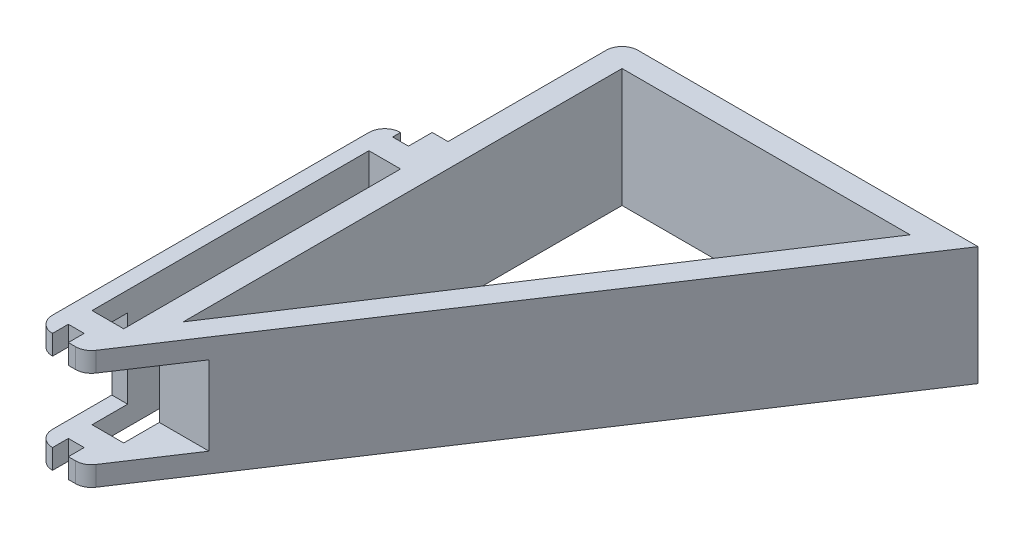
ISO-10303-21;
HEADER;
FILE_DESCRIPTION(('STEP AP214'),'2;1');
FILE_NAME('part.step','',(''),(''),'','','');
FILE_SCHEMA(('AUTOMOTIVE_DESIGN { 1 0 10303 214 1 1 1 1 }'));
ENDSEC;
DATA;
#1=APPLICATION_CONTEXT('core data for automotive mechanical design processes');
#2=APPLICATION_PROTOCOL_DEFINITION('international standard','automotive_design',2000,#1);
#3=PRODUCT_CONTEXT('',#1,'mechanical');
#4=PRODUCT('Part','Part','',(#3));
#5=PRODUCT_RELATED_PRODUCT_CATEGORY('part','',(#4));
#6=PRODUCT_DEFINITION_FORMATION('','',#4);
#7=PRODUCT_DEFINITION_CONTEXT('part definition',#1,'design');
#8=PRODUCT_DEFINITION('design','',#6,#7);
#9=PRODUCT_DEFINITION_SHAPE('','',#8);
#10=(LENGTH_UNIT() NAMED_UNIT(*) SI_UNIT(.MILLI.,.METRE.));
#11=(NAMED_UNIT(*) PLANE_ANGLE_UNIT() SI_UNIT($,.RADIAN.));
#12=(NAMED_UNIT(*) SI_UNIT($,.STERADIAN.) SOLID_ANGLE_UNIT());
#13=UNCERTAINTY_MEASURE_WITH_UNIT(LENGTH_MEASURE(1.E-05),#10,'distance_accuracy_value','');
#14=(GEOMETRIC_REPRESENTATION_CONTEXT(3) GLOBAL_UNCERTAINTY_ASSIGNED_CONTEXT((#13)) GLOBAL_UNIT_ASSIGNED_CONTEXT((#10,
#11,#12)) REPRESENTATION_CONTEXT('',''));
#15=CARTESIAN_POINT('',(0.,0.,0.));
#16=DIRECTION('',(0.,0.,1.));
#17=DIRECTION('',(1.,0.,0.));
#18=AXIS2_PLACEMENT_3D('',#15,#16,#17);
#19=CARTESIAN_POINT('',(0.,15.,-2.));
#20=DIRECTION('',(0.,-1.,0.));
#21=DIRECTION('',(0.,0.,-1.));
#22=AXIS2_PLACEMENT_3D('',#19,#20,#21);
#23=CYLINDRICAL_SURFACE('',#22,2.);
#24=DIRECTION('',(0.,-1.,0.));
#25=VECTOR('',#24,1.);
#26=CARTESIAN_POINT('',(0.,15.,0.));
#27=LINE('',#26,#25);
#28=CARTESIAN_POINT('',(0.,2.5,0.));
#29=VERTEX_POINT('',#28);
#30=CARTESIAN_POINT('',(0.,0.,0.));
#31=VERTEX_POINT('',#30);
#32=EDGE_CURVE('E468',#29,#31,#27,.T.);
#33=ORIENTED_EDGE('',*,*,#32,.F.);
#34=CARTESIAN_POINT('',(0.,2.5,-2.));
#35=DIRECTION('',(0.,1.,0.));
#36=DIRECTION('',(0.,0.,1.));
#37=AXIS2_PLACEMENT_3D('',#34,#35,#36);
#38=CIRCLE('',#37,2.);
#39=CARTESIAN_POINT('',(-2.,2.5,-2.));
#40=VERTEX_POINT('',#39);
#41=EDGE_CURVE('E42',#40,#29,#38,.T.);
#42=ORIENTED_EDGE('',*,*,#41,.F.);
#43=DIRECTION('',(0.,-1.,0.));
#44=VECTOR('',#43,1.);
#45=CARTESIAN_POINT('',(-2.,15.,-2.));
#46=LINE('',#45,#44);
#47=CARTESIAN_POINT('',(-2.,0.,-2.));
#48=VERTEX_POINT('',#47);
#49=EDGE_CURVE('E534',#48,#40,#46,.F.);
#50=ORIENTED_EDGE('',*,*,#49,.F.);
#51=CARTESIAN_POINT('',(0.,0.,-2.));
#52=DIRECTION('',(0.,1.,0.));
#53=DIRECTION('',(0.,0.,1.));
#54=AXIS2_PLACEMENT_3D('',#51,#52,#53);
#55=CIRCLE('',#54,2.);
#56=EDGE_CURVE('E11',#31,#48,#55,.F.);
#57=ORIENTED_EDGE('',*,*,#56,.F.);
#58=EDGE_LOOP('',(#33,#42,#50,#57));
#59=FACE_BOUND('',#58,.T.);
#60=ADVANCED_FACE('F35',(#59),#23,.T.);
#61=CARTESIAN_POINT('',(0.,15.,-2.));
#62=DIRECTION('',(0.,-1.,0.));
#63=DIRECTION('',(0.,0.,-1.));
#64=AXIS2_PLACEMENT_3D('',#61,#62,#63);
#65=CYLINDRICAL_SURFACE('',#64,2.);
#66=CARTESIAN_POINT('',(0.,15.,0.));
#67=VERTEX_POINT('',#66);
#68=CARTESIAN_POINT('',(0.,12.5,0.));
#69=VERTEX_POINT('',#68);
#70=EDGE_CURVE('E469',#67,#69,#27,.T.);
#71=ORIENTED_EDGE('',*,*,#70,.F.);
#72=CARTESIAN_POINT('',(0.,15.,-2.));
#73=DIRECTION('',(0.,1.,0.));
#74=DIRECTION('',(0.,0.,1.));
#75=AXIS2_PLACEMENT_3D('',#72,#73,#74);
#76=CIRCLE('',#75,2.);
#77=CARTESIAN_POINT('',(-2.,15.,-2.));
#78=VERTEX_POINT('',#77);
#79=EDGE_CURVE('E532',#78,#67,#76,.T.);
#80=ORIENTED_EDGE('',*,*,#79,.F.);
#81=DIRECTION('',(0.,-1.,0.));
#82=VECTOR('',#81,1.);
#83=CARTESIAN_POINT('',(-2.,15.,-2.));
#84=LINE('',#83,#82);
#85=CARTESIAN_POINT('',(-2.,12.5,-2.));
#86=VERTEX_POINT('',#85);
#87=EDGE_CURVE('E529',#86,#78,#84,.F.);
#88=ORIENTED_EDGE('',*,*,#87,.F.);
#89=CARTESIAN_POINT('',(0.,12.5,-2.));
#90=DIRECTION('',(0.,-1.,0.));
#91=DIRECTION('',(0.,0.,-1.));
#92=AXIS2_PLACEMENT_3D('',#89,#90,#91);
#93=CIRCLE('',#92,2.);
#94=EDGE_CURVE('E526',#69,#86,#93,.T.);
#95=ORIENTED_EDGE('',*,*,#94,.F.);
#96=EDGE_LOOP('',(#71,#80,#88,#95));
#97=FACE_BOUND('',#96,.T.);
#98=ADVANCED_FACE('F614',(#97),#65,.T.);
#99=CARTESIAN_POINT('',(2.92525292565927,15.,-2.));
#100=DIRECTION('',(0.,-1.,0.));
#101=DIRECTION('',(0.,0.,-1.));
#102=AXIS2_PLACEMENT_3D('',#99,#100,#101);
#103=CYLINDRICAL_SURFACE('',#102,2.);
#104=DIRECTION('',(0.,-1.,0.));
#105=VECTOR('',#104,1.);
#106=CARTESIAN_POINT('',(4.59311733711235,15.,-0.89626619830311));
#107=LINE('',#106,#105);
#108=CARTESIAN_POINT('',(4.59311733711235,15.,-0.89626619830311));
#109=VERTEX_POINT('',#108);
#110=CARTESIAN_POINT('',(4.59311733711235,12.5,-0.89626619830311));
#111=VERTEX_POINT('',#110);
#112=EDGE_CURVE('E517',#109,#111,#107,.T.);
#113=ORIENTED_EDGE('',*,*,#112,.F.);
#114=CARTESIAN_POINT('',(2.92525292565927,15.,-2.));
#115=DIRECTION('',(0.,1.,0.));
#116=DIRECTION('',(0.,0.,1.));
#117=AXIS2_PLACEMENT_3D('',#114,#115,#116);
#118=CIRCLE('',#117,2.);
#119=CARTESIAN_POINT('',(2.92525292565927,15.,0.));
#120=VERTEX_POINT('',#119);
#121=EDGE_CURVE('E522',#120,#109,#118,.T.);
#122=ORIENTED_EDGE('',*,*,#121,.F.);
#123=DIRECTION('',(0.,-1.,0.));
#124=VECTOR('',#123,1.);
#125=CARTESIAN_POINT('',(2.92525292565927,15.,0.));
#126=LINE('',#125,#124);
#127=CARTESIAN_POINT('',(2.92525292565927,12.5,0.));
#128=VERTEX_POINT('',#127);
#129=EDGE_CURVE('E519',#128,#120,#126,.F.);
#130=ORIENTED_EDGE('',*,*,#129,.F.);
#131=CARTESIAN_POINT('',(2.92525292565927,12.5,-2.));
#132=DIRECTION('',(0.,-1.,0.));
#133=DIRECTION('',(0.,0.,-1.));
#134=AXIS2_PLACEMENT_3D('',#131,#132,#133);
#135=CIRCLE('',#134,2.);
#136=EDGE_CURVE('E524',#111,#128,#135,.T.);
#137=ORIENTED_EDGE('',*,*,#136,.F.);
#138=EDGE_LOOP('',(#113,#122,#130,#137));
#139=FACE_BOUND('',#138,.T.);
#140=ADVANCED_FACE('F618',(#139),#103,.T.);
#141=CARTESIAN_POINT('',(2.92525292565927,15.,-2.));
#142=DIRECTION('',(0.,-1.,0.));
#143=DIRECTION('',(0.,0.,-1.));
#144=AXIS2_PLACEMENT_3D('',#141,#142,#143);
#145=CYLINDRICAL_SURFACE('',#144,2.);
#146=DIRECTION('',(0.,-1.,0.));
#147=VECTOR('',#146,1.);
#148=CARTESIAN_POINT('',(4.59311733711235,15.,-0.89626619830311));
#149=LINE('',#148,#147);
#150=CARTESIAN_POINT('',(4.59311733711235,2.5,-0.896266198303109));
#151=VERTEX_POINT('',#150);
#152=CARTESIAN_POINT('',(4.59311733711235,0.,-0.89626619830311));
#153=VERTEX_POINT('',#152);
#154=EDGE_CURVE('E509',#151,#153,#149,.T.);
#155=ORIENTED_EDGE('',*,*,#154,.F.);
#156=CARTESIAN_POINT('',(2.92525292565927,2.5,-2.));
#157=DIRECTION('',(0.,1.,0.));
#158=DIRECTION('',(0.,0.,1.));
#159=AXIS2_PLACEMENT_3D('',#156,#157,#158);
#160=CIRCLE('',#159,2.);
#161=CARTESIAN_POINT('',(2.92525292565927,2.5,0.));
#162=VERTEX_POINT('',#161);
#163=EDGE_CURVE('E273',#162,#151,#160,.T.);
#164=ORIENTED_EDGE('',*,*,#163,.F.);
#165=DIRECTION('',(0.,-1.,0.));
#166=VECTOR('',#165,1.);
#167=CARTESIAN_POINT('',(2.92525292565927,15.,0.));
#168=LINE('',#167,#166);
#169=CARTESIAN_POINT('',(2.92525292565927,0.,0.));
#170=VERTEX_POINT('',#169);
#171=EDGE_CURVE('E511',#170,#162,#168,.F.);
#172=ORIENTED_EDGE('',*,*,#171,.F.);
#173=CARTESIAN_POINT('',(2.92525292565927,0.,-2.));
#174=DIRECTION('',(0.,1.,0.));
#175=DIRECTION('',(0.,0.,1.));
#176=AXIS2_PLACEMENT_3D('',#173,#174,#175);
#177=CIRCLE('',#176,2.);
#178=EDGE_CURVE('E515',#153,#170,#177,.F.);
#179=ORIENTED_EDGE('',*,*,#178,.F.);
#180=EDGE_LOOP('',(#155,#164,#172,#179));
#181=FACE_BOUND('',#180,.T.);
#182=ADVANCED_FACE('F591',(#181),#145,.T.);
#183=CARTESIAN_POINT('',(6.,15.,-66.));
#184=DIRECTION('',(0.,-1.,0.));
#185=DIRECTION('',(0.,0.,-1.));
#186=AXIS2_PLACEMENT_3D('',#183,#184,#185);
#187=CYLINDRICAL_SURFACE('',#186,2.);
#188=DIRECTION('',(0.,-1.,0.));
#189=VECTOR('',#188,1.);
#190=CARTESIAN_POINT('',(4.,15.,-66.));
#191=LINE('',#190,#189);
#192=CARTESIAN_POINT('',(4.,15.,-66.));
#193=VERTEX_POINT('',#192);
#194=CARTESIAN_POINT('',(4.,0.,-66.));
#195=VERTEX_POINT('',#194);
#196=EDGE_CURVE('E499',#193,#195,#191,.T.);
#197=ORIENTED_EDGE('',*,*,#196,.F.);
#198=CARTESIAN_POINT('',(6.,15.,-66.));
#199=DIRECTION('',(0.,1.,0.));
#200=DIRECTION('',(0.,0.,1.));
#201=AXIS2_PLACEMENT_3D('',#198,#199,#200);
#202=CIRCLE('',#201,2.);
#203=CARTESIAN_POINT('',(6.,15.,-68.));
#204=VERTEX_POINT('',#203);
#205=EDGE_CURVE('E505',#204,#193,#202,.T.);
#206=ORIENTED_EDGE('',*,*,#205,.F.);
#207=DIRECTION('',(0.,-1.,0.));
#208=VECTOR('',#207,1.);
#209=CARTESIAN_POINT('',(6.,15.,-68.));
#210=LINE('',#209,#208);
#211=CARTESIAN_POINT('',(6.,0.,-68.));
#212=VERTEX_POINT('',#211);
#213=EDGE_CURVE('E502',#212,#204,#210,.F.);
#214=ORIENTED_EDGE('',*,*,#213,.F.);
#215=CARTESIAN_POINT('',(6.,0.,-66.));
#216=DIRECTION('',(0.,1.,0.));
#217=DIRECTION('',(0.,0.,1.));
#218=AXIS2_PLACEMENT_3D('',#215,#216,#217);
#219=CIRCLE('',#218,2.);
#220=EDGE_CURVE('E507',#195,#212,#219,.F.);
#221=ORIENTED_EDGE('',*,*,#220,.F.);
#222=EDGE_LOOP('',(#197,#206,#214,#221));
#223=FACE_BOUND('',#222,.T.);
#224=ADVANCED_FACE('F582',(#223),#187,.T.);
#225=CARTESIAN_POINT('',(0.,15.,-42.));
#226=DIRECTION('',(0.,-1.,0.));
#227=DIRECTION('',(0.,0.,-1.));
#228=AXIS2_PLACEMENT_3D('',#225,#226,#227);
#229=CYLINDRICAL_SURFACE('',#228,2.);
#230=DIRECTION('',(0.,-1.,0.));
#231=VECTOR('',#230,1.);
#232=CARTESIAN_POINT('',(-2.,15.,-42.));
#233=LINE('',#232,#231);
#234=CARTESIAN_POINT('',(-2.,15.,-42.));
#235=VERTEX_POINT('',#234);
#236=CARTESIAN_POINT('',(-2.,0.,-42.));
#237=VERTEX_POINT('',#236);
#238=EDGE_CURVE('E492',#235,#237,#233,.T.);
#239=ORIENTED_EDGE('',*,*,#238,.F.);
#240=CARTESIAN_POINT('',(0.,15.,-42.));
#241=DIRECTION('',(0.,1.,0.));
#242=DIRECTION('',(0.,0.,1.));
#243=AXIS2_PLACEMENT_3D('',#240,#241,#242);
#244=CIRCLE('',#243,2.);
#245=CARTESIAN_POINT('',(0.,15.,-44.));
#246=VERTEX_POINT('',#245);
#247=EDGE_CURVE('E495',#246,#235,#244,.T.);
#248=ORIENTED_EDGE('',*,*,#247,.F.);
#249=DIRECTION('',(0.,-1.,0.));
#250=VECTOR('',#249,1.);
#251=CARTESIAN_POINT('',(0.,15.,-44.));
#252=LINE('',#251,#250);
#253=CARTESIAN_POINT('',(0.,0.,-44.));
#254=VERTEX_POINT('',#253);
#255=EDGE_CURVE('E472',#246,#254,#252,.T.);
#256=ORIENTED_EDGE('',*,*,#255,.T.);
#257=CARTESIAN_POINT('',(0.,0.,-42.));
#258=DIRECTION('',(0.,1.,0.));
#259=DIRECTION('',(0.,0.,1.));
#260=AXIS2_PLACEMENT_3D('',#257,#258,#259);
#261=CIRCLE('',#260,2.);
#262=EDGE_CURVE('E497',#237,#254,#261,.F.);
#263=ORIENTED_EDGE('',*,*,#262,.F.);
#264=EDGE_LOOP('',(#239,#248,#256,#263));
#265=FACE_BOUND('',#264,.T.);
#266=ADVANCED_FACE('F555',(#265),#229,.T.);
#267=CARTESIAN_POINT('',(0.,15.,0.));
#268=DIRECTION('',(0.,0.,-1.));
#269=DIRECTION('',(-1.,0.,0.));
#270=AXIS2_PLACEMENT_3D('',#267,#268,#269);
#271=PLANE('',#270);
#272=DIRECTION('',(1.,0.,0.));
#273=VECTOR('',#272,1.);
#274=CARTESIAN_POINT('',(0.,0.,0.));
#275=LINE('',#274,#273);
#276=CARTESIAN_POINT('',(2.,0.,0.));
#277=VERTEX_POINT('',#276);
#278=EDGE_CURVE('E409',#277,#170,#275,.T.);
#279=ORIENTED_EDGE('',*,*,#278,.T.);
#280=ORIENTED_EDGE('',*,*,#171,.T.);
#281=DIRECTION('',(1.,0.,0.));
#282=VECTOR('',#281,1.);
#283=CARTESIAN_POINT('',(-121.1417281352,2.5,0.));
#284=LINE('',#283,#282);
#285=CARTESIAN_POINT('',(2.,2.5,0.));
#286=VERTEX_POINT('',#285);
#287=EDGE_CURVE('E297',#286,#162,#284,.T.);
#288=ORIENTED_EDGE('',*,*,#287,.F.);
#289=DIRECTION('',(0.,-1.,0.));
#290=VECTOR('',#289,1.);
#291=CARTESIAN_POINT('',(2.,15.,0.));
#292=LINE('',#291,#290);
#293=EDGE_CURVE('E456',#286,#277,#292,.T.);
#294=ORIENTED_EDGE('',*,*,#293,.T.);
#295=EDGE_LOOP('',(#279,#280,#288,#294));
#296=FACE_BOUND('',#295,.T.);
#297=ADVANCED_FACE('F593',(#296),#271,.F.);
#298=CARTESIAN_POINT('',(0.,15.,-5.));
#299=DIRECTION('',(0.,0.,-1.));
#300=DIRECTION('',(-1.,0.,0.));
#301=AXIS2_PLACEMENT_3D('',#298,#299,#300);
#302=PLANE('',#301);
#303=DIRECTION('',(0.,-1.,0.));
#304=VECTOR('',#303,1.);
#305=CARTESIAN_POINT('',(4.,15.,-5.));
#306=LINE('',#305,#304);
#307=CARTESIAN_POINT('',(4.,15.,-5.));
#308=VERTEX_POINT('',#307);
#309=CARTESIAN_POINT('',(4.,12.5,-5.));
#310=VERTEX_POINT('',#309);
#311=EDGE_CURVE('E442',#308,#310,#306,.T.);
#312=ORIENTED_EDGE('',*,*,#311,.T.);
#313=DIRECTION('',(-1.,0.,0.));
#314=VECTOR('',#313,1.);
#315=CARTESIAN_POINT('',(0.,12.5,-5.));
#316=LINE('',#315,#314);
#317=CARTESIAN_POINT('',(0.,12.5,-5.));
#318=VERTEX_POINT('',#317);
#319=EDGE_CURVE('E323',#310,#318,#316,.T.);
#320=ORIENTED_EDGE('',*,*,#319,.T.);
#321=DIRECTION('',(0.,-1.,0.));
#322=VECTOR('',#321,1.);
#323=CARTESIAN_POINT('',(0.,15.,-5.));
#324=LINE('',#323,#322);
#325=CARTESIAN_POINT('',(0.,15.,-5.));
#326=VERTEX_POINT('',#325);
#327=EDGE_CURVE('E437',#326,#318,#324,.T.);
#328=ORIENTED_EDGE('',*,*,#327,.F.);
#329=DIRECTION('',(1.,0.,0.));
#330=VECTOR('',#329,1.);
#331=CARTESIAN_POINT('',(0.,15.,-5.));
#332=LINE('',#331,#330);
#333=EDGE_CURVE('E368',#326,#308,#332,.T.);
#334=ORIENTED_EDGE('',*,*,#333,.T.);
#335=EDGE_LOOP('',(#312,#320,#328,#334));
#336=FACE_BOUND('',#335,.T.);
#337=ADVANCED_FACE('F696',(#336),#302,.T.);
#338=CARTESIAN_POINT('',(0.,2.5,-5.));
#339=VERTEX_POINT('',#338);
#340=CARTESIAN_POINT('',(0.,0.,-5.));
#341=VERTEX_POINT('',#340);
#342=EDGE_CURVE('E451',#339,#341,#324,.T.);
#343=ORIENTED_EDGE('',*,*,#342,.F.);
#344=DIRECTION('',(1.,0.,0.));
#345=VECTOR('',#344,1.);
#346=CARTESIAN_POINT('',(0.,2.5,-5.));
#347=LINE('',#346,#345);
#348=CARTESIAN_POINT('',(4.00000000000001,2.5,-5.));
#349=VERTEX_POINT('',#348);
#350=EDGE_CURVE('E311',#339,#349,#347,.T.);
#351=ORIENTED_EDGE('',*,*,#350,.T.);
#352=CARTESIAN_POINT('',(4.,0.,-5.));
#353=VERTEX_POINT('',#352);
#354=EDGE_CURVE('E446',#349,#353,#306,.T.);
#355=ORIENTED_EDGE('',*,*,#354,.T.);
#356=DIRECTION('',(1.,0.,0.));
#357=VECTOR('',#356,1.);
#358=CARTESIAN_POINT('',(0.,0.,-5.));
#359=LINE('',#358,#357);
#360=EDGE_CURVE('E417',#341,#353,#359,.T.);
#361=ORIENTED_EDGE('',*,*,#360,.F.);
#362=EDGE_LOOP('',(#343,#351,#355,#361));
#363=FACE_BOUND('',#362,.T.);
#364=ADVANCED_FACE('F651',(#363),#302,.T.);
#365=CARTESIAN_POINT('',(0.,15.,0.));
#366=DIRECTION('',(1.,0.,0.));
#367=DIRECTION('',(0.,0.,-1.));
#368=AXIS2_PLACEMENT_3D('',#365,#366,#367);
#369=PLANE('',#368);
#370=ORIENTED_EDGE('',*,*,#327,.T.);
#371=DIRECTION('',(0.,0.,-1.));
#372=VECTOR('',#371,1.);
#373=CARTESIAN_POINT('',(0.,12.5,0.));
#374=LINE('',#373,#372);
#375=CARTESIAN_POINT('',(0.,12.5,-9.5));
#376=VERTEX_POINT('',#375);
#377=EDGE_CURVE('E325',#318,#376,#374,.T.);
#378=ORIENTED_EDGE('',*,*,#377,.T.);
#379=DIRECTION('',(0.,-1.,0.));
#380=VECTOR('',#379,1.);
#381=CARTESIAN_POINT('',(0.,15.,-9.5));
#382=LINE('',#381,#380);
#383=CARTESIAN_POINT('',(0.,2.5,-9.5));
#384=VERTEX_POINT('',#383);
#385=EDGE_CURVE('E290',#376,#384,#382,.T.);
#386=ORIENTED_EDGE('',*,*,#385,.T.);
#387=DIRECTION('',(0.,0.,1.));
#388=VECTOR('',#387,1.);
#389=CARTESIAN_POINT('',(0.,2.5,0.));
#390=LINE('',#389,#388);
#391=EDGE_CURVE('E278',#384,#339,#390,.T.);
#392=ORIENTED_EDGE('',*,*,#391,.T.);
#393=ORIENTED_EDGE('',*,*,#342,.T.);
#394=DIRECTION('',(0.,0.,1.));
#395=VECTOR('',#394,1.);
#396=CARTESIAN_POINT('',(0.,0.,0.));
#397=LINE('',#396,#395);
#398=CARTESIAN_POINT('',(0.,0.,-40.));
#399=VERTEX_POINT('',#398);
#400=EDGE_CURVE('E420',#399,#341,#397,.T.);
#401=ORIENTED_EDGE('',*,*,#400,.F.);
#402=DIRECTION('',(0.,-1.,0.));
#403=VECTOR('',#402,1.);
#404=CARTESIAN_POINT('',(0.,15.,-40.));
#405=LINE('',#404,#403);
#406=CARTESIAN_POINT('',(0.,15.,-40.));
#407=VERTEX_POINT('',#406);
#408=EDGE_CURVE('E449',#407,#399,#405,.T.);
#409=ORIENTED_EDGE('',*,*,#408,.F.);
#410=DIRECTION('',(0.,0.,1.));
#411=VECTOR('',#410,1.);
#412=CARTESIAN_POINT('',(0.,15.,0.));
#413=LINE('',#412,#411);
#414=EDGE_CURVE('E371',#407,#326,#413,.T.);
#415=ORIENTED_EDGE('',*,*,#414,.T.);
#416=EDGE_LOOP('',(#370,#378,#386,#392,#393,#401,#409,#415));
#417=FACE_BOUND('',#416,.T.);
#418=ADVANCED_FACE('F645',(#417),#369,.T.);
#419=CARTESIAN_POINT('',(0.,15.,0.));
#420=DIRECTION('',(-1.,0.,0.));
#421=DIRECTION('',(0.,0.,1.));
#422=AXIS2_PLACEMENT_3D('',#419,#420,#421);
#423=PLANE('',#422);
#424=DIRECTION('',(0.,0.,1.));
#425=VECTOR('',#424,1.);
#426=CARTESIAN_POINT('',(0.,12.5,0.));
#427=LINE('',#426,#425);
#428=CARTESIAN_POINT('',(0.,12.5,-2.));
#429=VERTEX_POINT('',#428);
#430=EDGE_CURVE('E334',#429,#69,#427,.T.);
#431=ORIENTED_EDGE('',*,*,#430,.F.);
#432=DIRECTION('',(0.,-1.,0.));
#433=VECTOR('',#432,1.);
#434=CARTESIAN_POINT('',(0.,15.,-2.));
#435=LINE('',#434,#433);
#436=CARTESIAN_POINT('',(0.,15.,-2.));
#437=VERTEX_POINT('',#436);
#438=EDGE_CURVE('E465',#437,#429,#435,.T.);
#439=ORIENTED_EDGE('',*,*,#438,.F.);
#440=DIRECTION('',(0.,0.,-1.));
#441=VECTOR('',#440,1.);
#442=CARTESIAN_POINT('',(0.,15.,0.));
#443=LINE('',#442,#441);
#444=EDGE_CURVE('E354',#67,#437,#443,.T.);
#445=ORIENTED_EDGE('',*,*,#444,.F.);
#446=ORIENTED_EDGE('',*,*,#70,.T.);
#447=EDGE_LOOP('',(#431,#439,#445,#446));
#448=FACE_BOUND('',#447,.T.);
#449=ADVANCED_FACE('F643',(#448),#423,.F.);
#450=DIRECTION('',(0.,0.,-1.));
#451=VECTOR('',#450,1.);
#452=CARTESIAN_POINT('',(0.,2.5,0.));
#453=LINE('',#452,#451);
#454=CARTESIAN_POINT('',(0.,2.5,-2.));
#455=VERTEX_POINT('',#454);
#456=EDGE_CURVE('E291',#29,#455,#453,.T.);
#457=ORIENTED_EDGE('',*,*,#456,.F.);
#458=ORIENTED_EDGE('',*,*,#32,.T.);
#459=DIRECTION('',(0.,0.,-1.));
#460=VECTOR('',#459,1.);
#461=CARTESIAN_POINT('',(0.,0.,0.));
#462=LINE('',#461,#460);
#463=CARTESIAN_POINT('',(0.,0.,-2.));
#464=VERTEX_POINT('',#463);
#465=EDGE_CURVE('E400',#31,#464,#462,.T.);
#466=ORIENTED_EDGE('',*,*,#465,.T.);
#467=EDGE_CURVE('E464',#455,#464,#435,.T.);
#468=ORIENTED_EDGE('',*,*,#467,.F.);
#469=EDGE_LOOP('',(#457,#458,#466,#468));
#470=FACE_BOUND('',#469,.T.);
#471=ADVANCED_FACE('F540',(#470),#423,.F.);
#472=CARTESIAN_POINT('',(0.,15.,-2.));
#473=DIRECTION('',(0.,0.,-1.));
#474=DIRECTION('',(-1.,0.,0.));
#475=AXIS2_PLACEMENT_3D('',#472,#473,#474);
#476=PLANE('',#475);
#477=DIRECTION('',(-1.,0.,0.));
#478=VECTOR('',#477,1.);
#479=CARTESIAN_POINT('',(0.,12.5,-2.));
#480=LINE('',#479,#478);
#481=CARTESIAN_POINT('',(2.,12.5,-2.));
#482=VERTEX_POINT('',#481);
#483=EDGE_CURVE('E331',#482,#429,#480,.T.);
#484=ORIENTED_EDGE('',*,*,#483,.F.);
#485=DIRECTION('',(0.,-1.,0.));
#486=VECTOR('',#485,1.);
#487=CARTESIAN_POINT('',(2.,15.,-2.));
#488=LINE('',#487,#486);
#489=CARTESIAN_POINT('',(2.,15.,-2.));
#490=VERTEX_POINT('',#489);
#491=EDGE_CURVE('E461',#490,#482,#488,.T.);
#492=ORIENTED_EDGE('',*,*,#491,.F.);
#493=DIRECTION('',(1.,0.,0.));
#494=VECTOR('',#493,1.);
#495=CARTESIAN_POINT('',(0.,15.,-2.));
#496=LINE('',#495,#494);
#497=EDGE_CURVE('E356',#437,#490,#496,.T.);
#498=ORIENTED_EDGE('',*,*,#497,.F.);
#499=ORIENTED_EDGE('',*,*,#438,.T.);
#500=EDGE_LOOP('',(#484,#492,#498,#499));
#501=FACE_BOUND('',#500,.T.);
#502=ADVANCED_FACE('F603',(#501),#476,.F.);
#503=DIRECTION('',(1.,0.,0.));
#504=VECTOR('',#503,1.);
#505=CARTESIAN_POINT('',(0.,2.5,-2.));
#506=LINE('',#505,#504);
#507=CARTESIAN_POINT('',(2.,2.5,-2.));
#508=VERTEX_POINT('',#507);
#509=EDGE_CURVE('E317',#455,#508,#506,.T.);
#510=ORIENTED_EDGE('',*,*,#509,.F.);
#511=ORIENTED_EDGE('',*,*,#467,.T.);
#512=DIRECTION('',(1.,0.,0.));
#513=VECTOR('',#512,1.);
#514=CARTESIAN_POINT('',(0.,0.,-2.));
#515=LINE('',#514,#513);
#516=CARTESIAN_POINT('',(2.,0.,-2.));
#517=VERTEX_POINT('',#516);
#518=EDGE_CURVE('E403',#464,#517,#515,.T.);
#519=ORIENTED_EDGE('',*,*,#518,.T.);
#520=EDGE_CURVE('E460',#508,#517,#488,.T.);
#521=ORIENTED_EDGE('',*,*,#520,.F.);
#522=EDGE_LOOP('',(#510,#511,#519,#521));
#523=FACE_BOUND('',#522,.T.);
#524=ADVANCED_FACE('F600',(#523),#476,.F.);
#525=CARTESIAN_POINT('',(2.,15.,0.));
#526=DIRECTION('',(1.,0.,0.));
#527=DIRECTION('',(0.,0.,-1.));
#528=AXIS2_PLACEMENT_3D('',#525,#526,#527);
#529=PLANE('',#528);
#530=DIRECTION('',(0.,0.,-1.));
#531=VECTOR('',#530,1.);
#532=CARTESIAN_POINT('',(2.,12.5,0.));
#533=LINE('',#532,#531);
#534=CARTESIAN_POINT('',(2.,12.5,0.));
#535=VERTEX_POINT('',#534);
#536=EDGE_CURVE('E328',#535,#482,#533,.T.);
#537=ORIENTED_EDGE('',*,*,#536,.F.);
#538=CARTESIAN_POINT('',(2.,15.,0.));
#539=VERTEX_POINT('',#538);
#540=EDGE_CURVE('E457',#539,#535,#292,.T.);
#541=ORIENTED_EDGE('',*,*,#540,.F.);
#542=DIRECTION('',(0.,0.,1.));
#543=VECTOR('',#542,1.);
#544=CARTESIAN_POINT('',(2.,15.,0.));
#545=LINE('',#544,#543);
#546=EDGE_CURVE('E358',#490,#539,#545,.T.);
#547=ORIENTED_EDGE('',*,*,#546,.F.);
#548=ORIENTED_EDGE('',*,*,#491,.T.);
#549=EDGE_LOOP('',(#537,#541,#547,#548));
#550=FACE_BOUND('',#549,.T.);
#551=ADVANCED_FACE('F602',(#550),#529,.F.);
#552=DIRECTION('',(0.,0.,1.));
#553=VECTOR('',#552,1.);
#554=CARTESIAN_POINT('',(2.,2.5,0.));
#555=LINE('',#554,#553);
#556=EDGE_CURVE('E277',#508,#286,#555,.T.);
#557=ORIENTED_EDGE('',*,*,#556,.F.);
#558=ORIENTED_EDGE('',*,*,#520,.T.);
#559=DIRECTION('',(0.,0.,1.));
#560=VECTOR('',#559,1.);
#561=CARTESIAN_POINT('',(2.,0.,0.));
#562=LINE('',#561,#560);
#563=EDGE_CURVE('E406',#517,#277,#562,.T.);
#564=ORIENTED_EDGE('',*,*,#563,.T.);
#565=ORIENTED_EDGE('',*,*,#293,.F.);
#566=EDGE_LOOP('',(#557,#558,#564,#565));
#567=FACE_BOUND('',#566,.T.);
#568=ADVANCED_FACE('F596',(#567),#529,.F.);
#569=CARTESIAN_POINT('',(2.78177169499173,15.,1.84087832756805));
#570=DIRECTION('',(-0.83393220572654,0.,-0.551866900848445));
#571=DIRECTION('',(-0.551866900848445,0.,0.83393220572654));
#572=AXIS2_PLACEMENT_3D('',#569,#570,#571);
#573=PLANE('',#572);
#574=DIRECTION('',(0.551866900848445,0.,-0.83393220572654));
#575=VECTOR('',#574,1.);
#576=CARTESIAN_POINT('',(2.78177169499173,15.,1.84087832756805));
#577=LINE('',#576,#575);
#578=CARTESIAN_POINT('',(49.,15.,-68.));
#579=VERTEX_POINT('',#578);
#580=EDGE_CURVE('E363',#109,#579,#577,.T.);
#581=ORIENTED_EDGE('',*,*,#580,.F.);
#582=ORIENTED_EDGE('',*,*,#112,.T.);
#583=DIRECTION('',(-0.551866900848445,0.,0.83393220572654));
#584=VECTOR('',#583,1.);
#585=CARTESIAN_POINT('',(2.78177169499173,12.5,1.84087832756805));
#586=LINE('',#585,#584);
#587=CARTESIAN_POINT('',(10.2867647058824,12.5,-9.5));
#588=VERTEX_POINT('',#587);
#589=EDGE_CURVE('E286',#588,#111,#586,.T.);
#590=ORIENTED_EDGE('',*,*,#589,.F.);
#591=DIRECTION('',(0.,1.,0.));
#592=VECTOR('',#591,1.);
#593=CARTESIAN_POINT('',(10.2867647058824,15.,-9.5));
#594=LINE('',#593,#592);
#595=CARTESIAN_POINT('',(10.2867647058824,2.5,-9.50000000000001));
#596=VERTEX_POINT('',#595);
#597=EDGE_CURVE('E281',#596,#588,#594,.T.);
#598=ORIENTED_EDGE('',*,*,#597,.F.);
#599=DIRECTION('',(0.551866900848445,0.,-0.83393220572654));
#600=VECTOR('',#599,1.);
#601=CARTESIAN_POINT('',(2.78177169499173,2.5,1.84087832756806));
#602=LINE('',#601,#600);
#603=EDGE_CURVE('E265',#151,#596,#602,.T.);
#604=ORIENTED_EDGE('',*,*,#603,.F.);
#605=ORIENTED_EDGE('',*,*,#154,.T.);
#606=DIRECTION('',(0.551866900848445,0.,-0.83393220572654));
#607=VECTOR('',#606,1.);
#608=CARTESIAN_POINT('',(2.78177169499173,0.,1.84087832756805));
#609=LINE('',#608,#607);
#610=CARTESIAN_POINT('',(49.,0.,-68.));
#611=VERTEX_POINT('',#610);
#612=EDGE_CURVE('E412',#153,#611,#609,.T.);
#613=ORIENTED_EDGE('',*,*,#612,.T.);
#614=DIRECTION('',(0.,-1.,0.));
#615=VECTOR('',#614,1.);
#616=CARTESIAN_POINT('',(49.,15.,-68.));
#617=LINE('',#616,#615);
#618=EDGE_CURVE('E385',#579,#611,#617,.T.);
#619=ORIENTED_EDGE('',*,*,#618,.F.);
#620=EDGE_LOOP('',(#581,#582,#590,#598,#604,#605,#613,#619));
#621=FACE_BOUND('',#620,.T.);
#622=ADVANCED_FACE('F283',(#621),#573,.F.);
#623=CARTESIAN_POINT('',(4.00000000000001,15.,0.));
#624=DIRECTION('',(1.,0.,0.));
#625=DIRECTION('',(0.,0.,-1.));
#626=AXIS2_PLACEMENT_3D('',#623,#624,#625);
#627=PLANE('',#626);
#628=DIRECTION('',(0.,0.,-1.));
#629=VECTOR('',#628,1.);
#630=CARTESIAN_POINT('',(4.00000000000001,12.5,0.));
#631=LINE('',#630,#629);
#632=CARTESIAN_POINT('',(4.00000000000001,12.5,-9.5));
#633=VERTEX_POINT('',#632);
#634=EDGE_CURVE('E489',#310,#633,#631,.T.);
#635=ORIENTED_EDGE('',*,*,#634,.F.);
#636=ORIENTED_EDGE('',*,*,#311,.F.);
#637=DIRECTION('',(0.,0.,1.));
#638=VECTOR('',#637,1.);
#639=CARTESIAN_POINT('',(4.00000000000001,15.,0.));
#640=LINE('',#639,#638);
#641=CARTESIAN_POINT('',(4.,15.,-40.));
#642=VERTEX_POINT('',#641);
#643=EDGE_CURVE('E342',#642,#308,#640,.T.);
#644=ORIENTED_EDGE('',*,*,#643,.F.);
#645=DIRECTION('',(0.,-1.,0.));
#646=VECTOR('',#645,1.);
#647=CARTESIAN_POINT('',(4.,15.,-40.));
#648=LINE('',#647,#646);
#649=CARTESIAN_POINT('',(4.,0.,-40.));
#650=VERTEX_POINT('',#649);
#651=EDGE_CURVE('E445',#642,#650,#648,.T.);
#652=ORIENTED_EDGE('',*,*,#651,.T.);
#653=DIRECTION('',(0.,0.,1.));
#654=VECTOR('',#653,1.);
#655=CARTESIAN_POINT('',(4.00000000000001,0.,0.));
#656=LINE('',#655,#654);
#657=EDGE_CURVE('E388',#650,#353,#656,.T.);
#658=ORIENTED_EDGE('',*,*,#657,.T.);
#659=ORIENTED_EDGE('',*,*,#354,.F.);
#660=DIRECTION('',(0.,0.,1.));
#661=VECTOR('',#660,1.);
#662=CARTESIAN_POINT('',(4.00000000000001,2.5,0.));
#663=LINE('',#662,#661);
#664=CARTESIAN_POINT('',(4.00000000000001,2.5,-9.5));
#665=VERTEX_POINT('',#664);
#666=EDGE_CURVE('E441',#665,#349,#663,.T.);
#667=ORIENTED_EDGE('',*,*,#666,.F.);
#668=DIRECTION('',(0.,-1.,0.));
#669=VECTOR('',#668,1.);
#670=CARTESIAN_POINT('',(4.00000000000001,15.,-9.5));
#671=LINE('',#670,#669);
#672=EDGE_CURVE('E295',#633,#665,#671,.T.);
#673=ORIENTED_EDGE('',*,*,#672,.F.);
#674=EDGE_LOOP('',(#635,#636,#644,#652,#658,#659,#667,#673));
#675=FACE_BOUND('',#674,.T.);
#676=ADVANCED_FACE('F700',(#675),#627,.F.);
#677=CARTESIAN_POINT('',(7.00000000000001,15.,0.));
#678=DIRECTION('',(1.,0.,0.));
#679=DIRECTION('',(0.,0.,-1.));
#680=AXIS2_PLACEMENT_3D('',#677,#678,#679);
#681=PLANE('',#680);
#682=DIRECTION('',(0.,0.,1.));
#683=VECTOR('',#682,1.);
#684=CARTESIAN_POINT('',(7.00000000000001,0.,0.));
#685=LINE('',#684,#683);
#686=CARTESIAN_POINT('',(7.,0.,-65.));
#687=VERTEX_POINT('',#686);
#688=CARTESIAN_POINT('',(7.00000000000001,0.,-9.51623848099053));
#689=VERTEX_POINT('',#688);
#690=EDGE_CURVE('E426',#687,#689,#685,.T.);
#691=ORIENTED_EDGE('',*,*,#690,.F.);
#692=DIRECTION('',(0.,-1.,0.));
#693=VECTOR('',#692,1.);
#694=CARTESIAN_POINT('',(7.,15.,-65.));
#695=LINE('',#694,#693);
#696=CARTESIAN_POINT('',(7.,15.,-65.));
#697=VERTEX_POINT('',#696);
#698=EDGE_CURVE('E439',#697,#687,#695,.T.);
#699=ORIENTED_EDGE('',*,*,#698,.F.);
#700=DIRECTION('',(0.,0.,1.));
#701=VECTOR('',#700,1.);
#702=CARTESIAN_POINT('',(7.00000000000001,15.,0.));
#703=LINE('',#702,#701);
#704=CARTESIAN_POINT('',(7.00000000000001,15.,-9.51623848099053));
#705=VERTEX_POINT('',#704);
#706=EDGE_CURVE('E377',#697,#705,#703,.T.);
#707=ORIENTED_EDGE('',*,*,#706,.T.);
#708=DIRECTION('',(0.,-1.,0.));
#709=VECTOR('',#708,1.);
#710=CARTESIAN_POINT('',(7.00000000000001,15.,-9.51623848099053));
#711=LINE('',#710,#709);
#712=EDGE_CURVE('E434',#705,#689,#711,.T.);
#713=ORIENTED_EDGE('',*,*,#712,.T.);
#714=EDGE_LOOP('',(#691,#699,#707,#713));
#715=FACE_BOUND('',#714,.T.);
#716=ADVANCED_FACE('F702',(#715),#681,.T.);
#717=CARTESIAN_POINT('',(0.,15.,-65.));
#718=DIRECTION('',(0.,0.,-1.));
#719=DIRECTION('',(-1.,0.,0.));
#720=AXIS2_PLACEMENT_3D('',#717,#718,#719);
#721=PLANE('',#720);
#722=DIRECTION('',(1.,0.,0.));
#723=VECTOR('',#722,1.);
#724=CARTESIAN_POINT('',(0.,0.,-65.));
#725=LINE('',#724,#723);
#726=CARTESIAN_POINT('',(43.4172911531948,0.,-65.));
#727=VERTEX_POINT('',#726);
#728=EDGE_CURVE('E429',#687,#727,#725,.T.);
#729=ORIENTED_EDGE('',*,*,#728,.T.);
#730=DIRECTION('',(0.,-1.,0.));
#731=VECTOR('',#730,1.);
#732=CARTESIAN_POINT('',(43.4172911531948,15.,-65.));
#733=LINE('',#732,#731);
#734=CARTESIAN_POINT('',(43.4172911531948,15.,-65.));
#735=VERTEX_POINT('',#734);
#736=EDGE_CURVE('E436',#735,#727,#733,.T.);
#737=ORIENTED_EDGE('',*,*,#736,.F.);
#738=DIRECTION('',(1.,0.,0.));
#739=VECTOR('',#738,1.);
#740=CARTESIAN_POINT('',(0.,15.,-65.));
#741=LINE('',#740,#739);
#742=EDGE_CURVE('E380',#697,#735,#741,.T.);
#743=ORIENTED_EDGE('',*,*,#742,.F.);
#744=ORIENTED_EDGE('',*,*,#698,.T.);
#745=EDGE_LOOP('',(#729,#737,#743,#744));
#746=FACE_BOUND('',#745,.T.);
#747=ADVANCED_FACE('F708',(#746),#721,.F.);
#748=CARTESIAN_POINT('',(0.,15.,-40.));
#749=DIRECTION('',(0.,0.,-1.));
#750=DIRECTION('',(-1.,0.,0.));
#751=AXIS2_PLACEMENT_3D('',#748,#749,#750);
#752=PLANE('',#751);
#753=DIRECTION('',(1.,0.,0.));
#754=VECTOR('',#753,1.);
#755=CARTESIAN_POINT('',(0.,0.,-40.));
#756=LINE('',#755,#754);
#757=EDGE_CURVE('E423',#399,#650,#756,.T.);
#758=ORIENTED_EDGE('',*,*,#757,.T.);
#759=ORIENTED_EDGE('',*,*,#651,.F.);
#760=DIRECTION('',(1.,0.,0.));
#761=VECTOR('',#760,1.);
#762=CARTESIAN_POINT('',(0.,15.,-40.));
#763=LINE('',#762,#761);
#764=EDGE_CURVE('E374',#407,#642,#763,.T.);
#765=ORIENTED_EDGE('',*,*,#764,.F.);
#766=ORIENTED_EDGE('',*,*,#408,.T.);
#767=EDGE_LOOP('',(#758,#759,#765,#766));
#768=FACE_BOUND('',#767,.T.);
#769=ADVANCED_FACE('F691',(#768),#752,.F.);
#770=CARTESIAN_POINT('',(4.,15.,-46.));
#771=VERTEX_POINT('',#770);
#772=EDGE_CURVE('E338',#193,#771,#640,.T.);
#773=ORIENTED_EDGE('',*,*,#772,.F.);
#774=ORIENTED_EDGE('',*,*,#196,.T.);
#775=CARTESIAN_POINT('',(4.,0.,-46.));
#776=VERTEX_POINT('',#775);
#777=EDGE_CURVE('E337',#195,#776,#656,.T.);
#778=ORIENTED_EDGE('',*,*,#777,.T.);
#779=DIRECTION('',(0.,-1.,0.));
#780=VECTOR('',#779,1.);
#781=CARTESIAN_POINT('',(4.,15.,-46.));
#782=LINE('',#781,#780);
#783=EDGE_CURVE('E484',#771,#776,#782,.T.);
#784=ORIENTED_EDGE('',*,*,#783,.F.);
#785=EDGE_LOOP('',(#773,#774,#778,#784));
#786=FACE_BOUND('',#785,.T.);
#787=ADVANCED_FACE('F576',(#786),#627,.F.);
#788=CARTESIAN_POINT('',(0.,15.,-46.));
#789=DIRECTION('',(0.,0.,1.));
#790=DIRECTION('',(1.,0.,0.));
#791=AXIS2_PLACEMENT_3D('',#788,#789,#790);
#792=PLANE('',#791);
#793=DIRECTION('',(-1.,0.,0.));
#794=VECTOR('',#793,1.);
#795=CARTESIAN_POINT('',(0.,0.,-46.));
#796=LINE('',#795,#794);
#797=CARTESIAN_POINT('',(2.,0.,-46.));
#798=VERTEX_POINT('',#797);
#799=EDGE_CURVE('E387',#776,#798,#796,.T.);
#800=ORIENTED_EDGE('',*,*,#799,.T.);
#801=DIRECTION('',(0.,-1.,0.));
#802=VECTOR('',#801,1.);
#803=CARTESIAN_POINT('',(2.,15.,-46.));
#804=LINE('',#803,#802);
#805=CARTESIAN_POINT('',(2.,15.,-46.));
#806=VERTEX_POINT('',#805);
#807=EDGE_CURVE('E481',#806,#798,#804,.T.);
#808=ORIENTED_EDGE('',*,*,#807,.F.);
#809=DIRECTION('',(-1.,0.,0.));
#810=VECTOR('',#809,1.);
#811=CARTESIAN_POINT('',(0.,15.,-46.));
#812=LINE('',#811,#810);
#813=EDGE_CURVE('E340',#771,#806,#812,.T.);
#814=ORIENTED_EDGE('',*,*,#813,.F.);
#815=ORIENTED_EDGE('',*,*,#783,.T.);
#816=EDGE_LOOP('',(#800,#808,#814,#815));
#817=FACE_BOUND('',#816,.T.);
#818=ADVANCED_FACE('F572',(#817),#792,.F.);
#819=CARTESIAN_POINT('',(2.00000000000001,15.,0.));
#820=DIRECTION('',(1.,0.,0.));
#821=DIRECTION('',(0.,0.,-1.));
#822=AXIS2_PLACEMENT_3D('',#819,#820,#821);
#823=PLANE('',#822);
#824=DIRECTION('',(0.,0.,1.));
#825=VECTOR('',#824,1.);
#826=CARTESIAN_POINT('',(2.00000000000001,0.,0.));
#827=LINE('',#826,#825);
#828=CARTESIAN_POINT('',(2.,0.,-43.));
#829=VERTEX_POINT('',#828);
#830=EDGE_CURVE('E390',#798,#829,#827,.T.);
#831=ORIENTED_EDGE('',*,*,#830,.T.);
#832=DIRECTION('',(0.,-1.,0.));
#833=VECTOR('',#832,1.);
#834=CARTESIAN_POINT('',(2.,15.,-43.));
#835=LINE('',#834,#833);
#836=CARTESIAN_POINT('',(2.,15.,-43.));
#837=VERTEX_POINT('',#836);
#838=EDGE_CURVE('E478',#837,#829,#835,.T.);
#839=ORIENTED_EDGE('',*,*,#838,.F.);
#840=DIRECTION('',(0.,0.,1.));
#841=VECTOR('',#840,1.);
#842=CARTESIAN_POINT('',(2.00000000000001,15.,0.));
#843=LINE('',#842,#841);
#844=EDGE_CURVE('E344',#806,#837,#843,.T.);
#845=ORIENTED_EDGE('',*,*,#844,.F.);
#846=ORIENTED_EDGE('',*,*,#807,.T.);
#847=EDGE_LOOP('',(#831,#839,#845,#846));
#848=FACE_BOUND('',#847,.T.);
#849=ADVANCED_FACE('F568',(#848),#823,.F.);
#850=CARTESIAN_POINT('',(1.49186218934005E-13,15.,-43.));
#851=DIRECTION('',(0.,0.,1.));
#852=DIRECTION('',(1.,0.,0.));
#853=AXIS2_PLACEMENT_3D('',#850,#851,#852);
#854=PLANE('',#853);
#855=DIRECTION('',(-1.,0.,0.));
#856=VECTOR('',#855,1.);
#857=CARTESIAN_POINT('',(1.49186218934005E-13,0.,-43.));
#858=LINE('',#857,#856);
#859=CARTESIAN_POINT('',(0.,0.,-43.));
#860=VERTEX_POINT('',#859);
#861=EDGE_CURVE('E392',#829,#860,#858,.T.);
#862=ORIENTED_EDGE('',*,*,#861,.T.);
#863=DIRECTION('',(0.,-1.,0.));
#864=VECTOR('',#863,1.);
#865=CARTESIAN_POINT('',(0.,15.,-43.));
#866=LINE('',#865,#864);
#867=CARTESIAN_POINT('',(0.,15.,-43.));
#868=VERTEX_POINT('',#867);
#869=EDGE_CURVE('E475',#868,#860,#866,.T.);
#870=ORIENTED_EDGE('',*,*,#869,.F.);
#871=DIRECTION('',(-1.,0.,0.));
#872=VECTOR('',#871,1.);
#873=CARTESIAN_POINT('',(1.49186218934005E-13,15.,-43.));
#874=LINE('',#873,#872);
#875=EDGE_CURVE('E346',#837,#868,#874,.T.);
#876=ORIENTED_EDGE('',*,*,#875,.F.);
#877=ORIENTED_EDGE('',*,*,#838,.T.);
#878=EDGE_LOOP('',(#862,#870,#876,#877));
#879=FACE_BOUND('',#878,.T.);
#880=ADVANCED_FACE('F563',(#879),#854,.F.);
#881=CARTESIAN_POINT('',(0.,15.,0.));
#882=DIRECTION('',(-1.,0.,0.));
#883=DIRECTION('',(0.,0.,1.));
#884=AXIS2_PLACEMENT_3D('',#881,#882,#883);
#885=PLANE('',#884);
#886=DIRECTION('',(0.,0.,-1.));
#887=VECTOR('',#886,1.);
#888=CARTESIAN_POINT('',(0.,0.,0.));
#889=LINE('',#888,#887);
#890=EDGE_CURVE('E394',#860,#254,#889,.T.);
#891=ORIENTED_EDGE('',*,*,#890,.T.);
#892=ORIENTED_EDGE('',*,*,#255,.F.);
#893=DIRECTION('',(0.,0.,-1.));
#894=VECTOR('',#893,1.);
#895=CARTESIAN_POINT('',(0.,15.,0.));
#896=LINE('',#895,#894);
#897=EDGE_CURVE('E348',#868,#246,#896,.T.);
#898=ORIENTED_EDGE('',*,*,#897,.F.);
#899=ORIENTED_EDGE('',*,*,#869,.T.);
#900=EDGE_LOOP('',(#891,#892,#898,#899));
#901=FACE_BOUND('',#900,.T.);
#902=ADVANCED_FACE('F552',(#901),#885,.F.);
#903=CARTESIAN_POINT('',(-2.,15.,0.));
#904=DIRECTION('',(1.,0.,0.));
#905=DIRECTION('',(0.,0.,-1.));
#906=AXIS2_PLACEMENT_3D('',#903,#904,#905);
#907=PLANE('',#906);
#908=DIRECTION('',(0.,0.,1.));
#909=VECTOR('',#908,1.);
#910=CARTESIAN_POINT('',(-2.,0.,0.));
#911=LINE('',#910,#909);
#912=EDGE_CURVE('E397',#237,#48,#911,.T.);
#913=ORIENTED_EDGE('',*,*,#912,.T.);
#914=ORIENTED_EDGE('',*,*,#49,.T.);
#915=DIRECTION('',(0.,0.,-1.));
#916=VECTOR('',#915,1.);
#917=CARTESIAN_POINT('',(-2.,2.5,0.));
#918=LINE('',#917,#916);
#919=CARTESIAN_POINT('',(-2.,2.5,-9.5));
#920=VERTEX_POINT('',#919);
#921=EDGE_CURVE('E301',#40,#920,#918,.T.);
#922=ORIENTED_EDGE('',*,*,#921,.T.);
#923=DIRECTION('',(0.,1.,0.));
#924=VECTOR('',#923,1.);
#925=CARTESIAN_POINT('',(-2.,2.5,-9.5));
#926=LINE('',#925,#924);
#927=CARTESIAN_POINT('',(-2.,12.5,-9.5));
#928=VERTEX_POINT('',#927);
#929=EDGE_CURVE('E672',#920,#928,#926,.T.);
#930=ORIENTED_EDGE('',*,*,#929,.T.);
#931=DIRECTION('',(0.,0.,1.));
#932=VECTOR('',#931,1.);
#933=CARTESIAN_POINT('',(-2.,12.5,-9.49999999999999));
#934=LINE('',#933,#932);
#935=EDGE_CURVE('E669',#928,#86,#934,.T.);
#936=ORIENTED_EDGE('',*,*,#935,.T.);
#937=ORIENTED_EDGE('',*,*,#87,.T.);
#938=DIRECTION('',(0.,0.,1.));
#939=VECTOR('',#938,1.);
#940=CARTESIAN_POINT('',(-2.,15.,0.));
#941=LINE('',#940,#939);
#942=EDGE_CURVE('E351',#235,#78,#941,.T.);
#943=ORIENTED_EDGE('',*,*,#942,.F.);
#944=ORIENTED_EDGE('',*,*,#238,.T.);
#945=EDGE_LOOP('',(#913,#914,#922,#930,#936,#937,#943,#944));
#946=FACE_BOUND('',#945,.T.);
#947=ADVANCED_FACE('F542',(#946),#907,.F.);
#948=DIRECTION('',(1.,0.,0.));
#949=VECTOR('',#948,1.);
#950=CARTESIAN_POINT('',(-121.1417281352,12.5,0.));
#951=LINE('',#950,#949);
#952=EDGE_CURVE('E308',#535,#128,#951,.T.);
#953=ORIENTED_EDGE('',*,*,#952,.T.);
#954=ORIENTED_EDGE('',*,*,#129,.T.);
#955=DIRECTION('',(1.,0.,0.));
#956=VECTOR('',#955,1.);
#957=CARTESIAN_POINT('',(0.,15.,0.));
#958=LINE('',#957,#956);
#959=EDGE_CURVE('E360',#539,#120,#958,.T.);
#960=ORIENTED_EDGE('',*,*,#959,.F.);
#961=ORIENTED_EDGE('',*,*,#540,.T.);
#962=EDGE_LOOP('',(#953,#954,#960,#961));
#963=FACE_BOUND('',#962,.T.);
#964=ADVANCED_FACE('F642',(#963),#271,.F.);
#965=CARTESIAN_POINT('',(0.,15.,-68.));
#966=DIRECTION('',(0.,0.,1.));
#967=DIRECTION('',(1.,0.,0.));
#968=AXIS2_PLACEMENT_3D('',#965,#966,#967);
#969=PLANE('',#968);
#970=DIRECTION('',(-1.,0.,0.));
#971=VECTOR('',#970,1.);
#972=CARTESIAN_POINT('',(0.,0.,-68.));
#973=LINE('',#972,#971);
#974=EDGE_CURVE('E414',#611,#212,#973,.T.);
#975=ORIENTED_EDGE('',*,*,#974,.T.);
#976=ORIENTED_EDGE('',*,*,#213,.T.);
#977=DIRECTION('',(-1.,0.,0.));
#978=VECTOR('',#977,1.);
#979=CARTESIAN_POINT('',(0.,15.,-68.));
#980=LINE('',#979,#978);
#981=EDGE_CURVE('E365',#579,#204,#980,.T.);
#982=ORIENTED_EDGE('',*,*,#981,.F.);
#983=ORIENTED_EDGE('',*,*,#618,.T.);
#984=EDGE_LOOP('',(#975,#976,#982,#983));
#985=FACE_BOUND('',#984,.T.);
#986=ADVANCED_FACE('F585',(#985),#969,.F.);
#987=CARTESIAN_POINT('',(0.526924014744326,15.,0.345851556116648));
#988=DIRECTION('',(-0.836005936955726,0.,-0.548720396353898));
#989=DIRECTION('',(-0.548720396353898,0.,0.836005936955726));
#990=AXIS2_PLACEMENT_3D('',#987,#988,#989);
#991=PLANE('',#990);
#992=DIRECTION('',(0.548720396353898,0.,-0.836005936955726));
#993=VECTOR('',#992,1.);
#994=CARTESIAN_POINT('',(0.526924014744326,0.,0.345851556116648));
#995=LINE('',#994,#993);
#996=EDGE_CURVE('E341',#689,#727,#995,.T.);
#997=ORIENTED_EDGE('',*,*,#996,.F.);
#998=ORIENTED_EDGE('',*,*,#712,.F.);
#999=DIRECTION('',(0.548720396353898,0.,-0.836005936955726));
#1000=VECTOR('',#999,1.);
#1001=CARTESIAN_POINT('',(0.526924014744326,15.,0.345851556116648));
#1002=LINE('',#1001,#1000);
#1003=EDGE_CURVE('E382',#705,#735,#1002,.T.);
#1004=ORIENTED_EDGE('',*,*,#1003,.T.);
#1005=ORIENTED_EDGE('',*,*,#736,.T.);
#1006=EDGE_LOOP('',(#997,#998,#1004,#1005));
#1007=FACE_BOUND('',#1006,.T.);
#1008=ADVANCED_FACE('F726',(#1007),#991,.T.);
#1009=CARTESIAN_POINT('',(0.,15.,0.));
#1010=DIRECTION('',(0.,1.,0.));
#1011=DIRECTION('',(0.,0.,1.));
#1012=AXIS2_PLACEMENT_3D('',#1009,#1010,#1011);
#1013=PLANE('',#1012);
#1014=ORIENTED_EDGE('',*,*,#942,.T.);
#1015=ORIENTED_EDGE('',*,*,#79,.T.);
#1016=ORIENTED_EDGE('',*,*,#444,.T.);
#1017=ORIENTED_EDGE('',*,*,#497,.T.);
#1018=ORIENTED_EDGE('',*,*,#546,.T.);
#1019=ORIENTED_EDGE('',*,*,#959,.T.);
#1020=ORIENTED_EDGE('',*,*,#121,.T.);
#1021=ORIENTED_EDGE('',*,*,#580,.T.);
#1022=ORIENTED_EDGE('',*,*,#981,.T.);
#1023=ORIENTED_EDGE('',*,*,#205,.T.);
#1024=ORIENTED_EDGE('',*,*,#772,.T.);
#1025=ORIENTED_EDGE('',*,*,#813,.T.);
#1026=ORIENTED_EDGE('',*,*,#844,.T.);
#1027=ORIENTED_EDGE('',*,*,#875,.T.);
#1028=ORIENTED_EDGE('',*,*,#897,.T.);
#1029=ORIENTED_EDGE('',*,*,#247,.T.);
#1030=EDGE_LOOP('',(#1014,#1015,#1016,#1017,#1018,#1019,#1020,#1021,#1022,#1023,#1024,#1025,
#1026,#1027,#1028,#1029));
#1031=FACE_BOUND('',#1030,.T.);
#1032=ORIENTED_EDGE('',*,*,#333,.F.);
#1033=ORIENTED_EDGE('',*,*,#414,.F.);
#1034=ORIENTED_EDGE('',*,*,#764,.T.);
#1035=ORIENTED_EDGE('',*,*,#643,.T.);
#1036=EDGE_LOOP('',(#1032,#1033,#1034,#1035));
#1037=FACE_BOUND('',#1036,.T.);
#1038=ORIENTED_EDGE('',*,*,#706,.F.);
#1039=ORIENTED_EDGE('',*,*,#742,.T.);
#1040=ORIENTED_EDGE('',*,*,#1003,.F.);
#1041=EDGE_LOOP('',(#1038,#1039,#1040));
#1042=FACE_BOUND('',#1041,.T.);
#1043=ADVANCED_FACE('F557',(#1031,#1037,#1042),#1013,.T.);
#1044=CARTESIAN_POINT('',(0.,0.,0.));
#1045=DIRECTION('',(0.,1.,0.));
#1046=DIRECTION('',(0.,0.,1.));
#1047=AXIS2_PLACEMENT_3D('',#1044,#1045,#1046);
#1048=PLANE('',#1047);
#1049=ORIENTED_EDGE('',*,*,#465,.F.);
#1050=ORIENTED_EDGE('',*,*,#56,.T.);
#1051=ORIENTED_EDGE('',*,*,#912,.F.);
#1052=ORIENTED_EDGE('',*,*,#262,.T.);
#1053=ORIENTED_EDGE('',*,*,#890,.F.);
#1054=ORIENTED_EDGE('',*,*,#861,.F.);
#1055=ORIENTED_EDGE('',*,*,#830,.F.);
#1056=ORIENTED_EDGE('',*,*,#799,.F.);
#1057=ORIENTED_EDGE('',*,*,#777,.F.);
#1058=ORIENTED_EDGE('',*,*,#220,.T.);
#1059=ORIENTED_EDGE('',*,*,#974,.F.);
#1060=ORIENTED_EDGE('',*,*,#612,.F.);
#1061=ORIENTED_EDGE('',*,*,#178,.T.);
#1062=ORIENTED_EDGE('',*,*,#278,.F.);
#1063=ORIENTED_EDGE('',*,*,#563,.F.);
#1064=ORIENTED_EDGE('',*,*,#518,.F.);
#1065=EDGE_LOOP('',(#1049,#1050,#1051,#1052,#1053,#1054,#1055,#1056,#1057,#1058,#1059,#1060,
#1061,#1062,#1063,#1064));
#1066=FACE_BOUND('',#1065,.T.);
#1067=ORIENTED_EDGE('',*,*,#360,.T.);
#1068=ORIENTED_EDGE('',*,*,#657,.F.);
#1069=ORIENTED_EDGE('',*,*,#757,.F.);
#1070=ORIENTED_EDGE('',*,*,#400,.T.);
#1071=EDGE_LOOP('',(#1067,#1068,#1069,#1070));
#1072=FACE_BOUND('',#1071,.T.);
#1073=ORIENTED_EDGE('',*,*,#690,.T.);
#1074=ORIENTED_EDGE('',*,*,#996,.T.);
#1075=ORIENTED_EDGE('',*,*,#728,.F.);
#1076=EDGE_LOOP('',(#1073,#1074,#1075));
#1077=FACE_BOUND('',#1076,.T.);
#1078=ADVANCED_FACE('F545',(#1066,#1072,#1077),#1048,.F.);
#1079=CARTESIAN_POINT('',(-121.1417281352,12.5,-9.49999999999998));
#1080=DIRECTION('',(0.,-1.,0.));
#1081=DIRECTION('',(0.,0.,-1.));
#1082=AXIS2_PLACEMENT_3D('',#1079,#1080,#1081);
#1083=PLANE('',#1082);
#1084=ORIENTED_EDGE('',*,*,#430,.T.);
#1085=ORIENTED_EDGE('',*,*,#94,.T.);
#1086=ORIENTED_EDGE('',*,*,#935,.F.);
#1087=DIRECTION('',(1.,0.,0.));
#1088=VECTOR('',#1087,1.);
#1089=CARTESIAN_POINT('',(-121.1417281352,12.5,-9.49999999999998));
#1090=LINE('',#1089,#1088);
#1091=EDGE_CURVE('E305',#928,#376,#1090,.T.);
#1092=ORIENTED_EDGE('',*,*,#1091,.T.);
#1093=ORIENTED_EDGE('',*,*,#377,.F.);
#1094=ORIENTED_EDGE('',*,*,#319,.F.);
#1095=ORIENTED_EDGE('',*,*,#634,.T.);
#1096=EDGE_CURVE('E300',#633,#588,#1090,.T.);
#1097=ORIENTED_EDGE('',*,*,#1096,.T.);
#1098=ORIENTED_EDGE('',*,*,#589,.T.);
#1099=ORIENTED_EDGE('',*,*,#136,.T.);
#1100=ORIENTED_EDGE('',*,*,#952,.F.);
#1101=ORIENTED_EDGE('',*,*,#536,.T.);
#1102=ORIENTED_EDGE('',*,*,#483,.T.);
#1103=EDGE_LOOP('',(#1084,#1085,#1086,#1092,#1093,#1094,#1095,#1097,#1098,#1099,#1100,#1101,#1102));
#1104=FACE_BOUND('',#1103,.T.);
#1105=ADVANCED_FACE('F659',(#1104),#1083,.T.);
#1106=CARTESIAN_POINT('',(-121.1417281352,2.5,-9.49999999999998));
#1107=DIRECTION('',(0.,0.,1.));
#1108=DIRECTION('',(1.,0.,0.));
#1109=AXIS2_PLACEMENT_3D('',#1106,#1107,#1108);
#1110=PLANE('',#1109);
#1111=DIRECTION('',(1.,0.,0.));
#1112=VECTOR('',#1111,1.);
#1113=CARTESIAN_POINT('',(-121.1417281352,2.5,-9.49999999999998));
#1114=LINE('',#1113,#1112);
#1115=EDGE_CURVE('E271',#665,#596,#1114,.T.);
#1116=ORIENTED_EDGE('',*,*,#1115,.T.);
#1117=ORIENTED_EDGE('',*,*,#597,.T.);
#1118=ORIENTED_EDGE('',*,*,#1096,.F.);
#1119=ORIENTED_EDGE('',*,*,#672,.T.);
#1120=EDGE_LOOP('',(#1116,#1117,#1118,#1119));
#1121=FACE_BOUND('',#1120,.T.);
#1122=ADVANCED_FACE('F294',(#1121),#1110,.T.);
#1123=CARTESIAN_POINT('',(-121.1417281352,2.5,0.));
#1124=DIRECTION('',(0.,1.,0.));
#1125=DIRECTION('',(0.,0.,1.));
#1126=AXIS2_PLACEMENT_3D('',#1123,#1124,#1125);
#1127=PLANE('',#1126);
#1128=ORIENTED_EDGE('',*,*,#921,.F.);
#1129=ORIENTED_EDGE('',*,*,#41,.T.);
#1130=ORIENTED_EDGE('',*,*,#456,.T.);
#1131=ORIENTED_EDGE('',*,*,#509,.T.);
#1132=ORIENTED_EDGE('',*,*,#556,.T.);
#1133=ORIENTED_EDGE('',*,*,#287,.T.);
#1134=ORIENTED_EDGE('',*,*,#163,.T.);
#1135=ORIENTED_EDGE('',*,*,#603,.T.);
#1136=ORIENTED_EDGE('',*,*,#1115,.F.);
#1137=ORIENTED_EDGE('',*,*,#666,.T.);
#1138=ORIENTED_EDGE('',*,*,#350,.F.);
#1139=ORIENTED_EDGE('',*,*,#391,.F.);
#1140=EDGE_CURVE('E296',#920,#384,#1114,.T.);
#1141=ORIENTED_EDGE('',*,*,#1140,.F.);
#1142=EDGE_LOOP('',(#1128,#1129,#1130,#1131,#1132,#1133,#1134,#1135,#1136,#1137,#1138,#1139,#1141));
#1143=FACE_BOUND('',#1142,.T.);
#1144=ADVANCED_FACE('F268',(#1143),#1127,.T.);
#1145=ORIENTED_EDGE('',*,*,#385,.F.);
#1146=ORIENTED_EDGE('',*,*,#1091,.F.);
#1147=ORIENTED_EDGE('',*,*,#929,.F.);
#1148=ORIENTED_EDGE('',*,*,#1140,.T.);
#1149=EDGE_LOOP('',(#1145,#1146,#1147,#1148));
#1150=FACE_BOUND('',#1149,.T.);
#1151=ADVANCED_FACE('F677',(#1150),#1110,.T.);
#1152=CLOSED_SHELL('',(#60,#98,#140,#182,#224,#266,#297,#337,#364,#418,#449,#471,#502,#524,#551,
#568,#622,#676,#716,#747,#769,#787,#818,#849,#880,#902,#947,#964,#986,#1008,#1043,#1078,#1105,
#1122,#1144,#1151));
#1153=MANIFOLD_SOLID_BREP('B2',#1152);
#1154=ADVANCED_BREP_SHAPE_REPRESENTATION('',(#18,#1153),#14);
#1155=SHAPE_DEFINITION_REPRESENTATION(#9,#1154);
ENDSEC;
END-ISO-10303-21;
